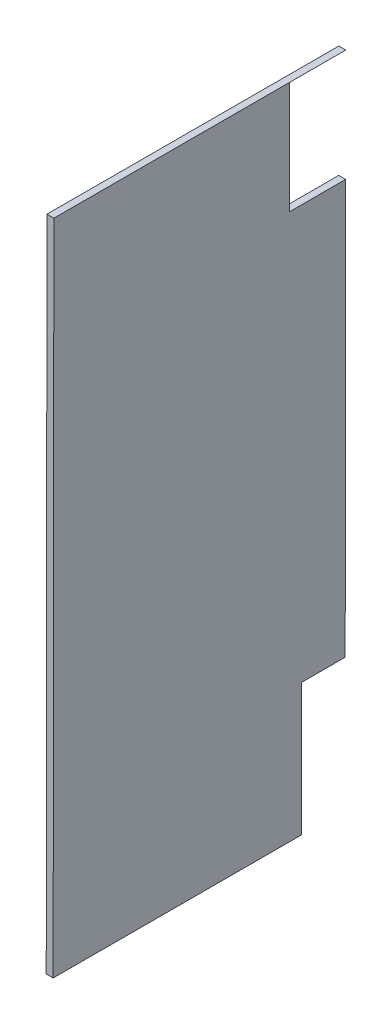
ISO-10303-21;
HEADER;
FILE_DESCRIPTION(('STEP AP214'),'2;1');
FILE_NAME('part.step','',(''),(''),'','','');
FILE_SCHEMA(('AUTOMOTIVE_DESIGN { 1 0 10303 214 1 1 1 1 }'));
ENDSEC;
DATA;
#1=APPLICATION_CONTEXT('core data for automotive mechanical design processes');
#2=APPLICATION_PROTOCOL_DEFINITION('international standard','automotive_design',2000,#1);
#3=PRODUCT_CONTEXT('',#1,'mechanical');
#4=PRODUCT('Part','Part','',(#3));
#5=PRODUCT_RELATED_PRODUCT_CATEGORY('part','',(#4));
#6=PRODUCT_DEFINITION_FORMATION('','',#4);
#7=PRODUCT_DEFINITION_CONTEXT('part definition',#1,'design');
#8=PRODUCT_DEFINITION('design','',#6,#7);
#9=PRODUCT_DEFINITION_SHAPE('','',#8);
#10=(LENGTH_UNIT() NAMED_UNIT(*) SI_UNIT(.MILLI.,.METRE.));
#11=(NAMED_UNIT(*) PLANE_ANGLE_UNIT() SI_UNIT($,.RADIAN.));
#12=(NAMED_UNIT(*) SI_UNIT($,.STERADIAN.) SOLID_ANGLE_UNIT());
#13=UNCERTAINTY_MEASURE_WITH_UNIT(LENGTH_MEASURE(1.E-05),#10,'distance_accuracy_value','');
#14=(GEOMETRIC_REPRESENTATION_CONTEXT(3) GLOBAL_UNCERTAINTY_ASSIGNED_CONTEXT((#13)) GLOBAL_UNIT_ASSIGNED_CONTEXT((#10,
#11,#12)) REPRESENTATION_CONTEXT('',''));
#15=CARTESIAN_POINT('',(0.,0.,0.));
#16=DIRECTION('',(0.,0.,1.));
#17=DIRECTION('',(1.,0.,0.));
#18=AXIS2_PLACEMENT_3D('',#15,#16,#17);
#19=CARTESIAN_POINT('',(5.08,1095.14597944637,-212.544479642971));
#20=DIRECTION('',(0.,0.00107241877587963,0.999999424958819));
#21=DIRECTION('',(0.,-0.999999424958819,0.00107241877587963));
#22=AXIS2_PLACEMENT_3D('',#19,#20,#21);
#23=PLANE('',#22);
#24=DIRECTION('',(0.,0.999999424958819,-0.00107241877587963));
#25=VECTOR('',#24,1.);
#26=CARTESIAN_POINT('',(0.,1095.14597944637,-212.544479642971));
#27=LINE('',#26,#25);
#28=CARTESIAN_POINT('',(0.,1192.07810946126,-212.648431538962));
#29=VERTEX_POINT('',#28);
#30=CARTESIAN_POINT('',(0.,1495.57463545746,-212.973907099016));
#31=VERTEX_POINT('',#30);
#32=EDGE_CURVE('E129',#29,#31,#27,.T.);
#33=ORIENTED_EDGE('',*,*,#32,.T.);
#34=DIRECTION('',(1.,0.,0.));
#35=VECTOR('',#34,1.);
#36=CARTESIAN_POINT('',(5.08,1495.57463545746,-212.973907099016));
#37=LINE('',#36,#35);
#38=CARTESIAN_POINT('',(5.08,1495.57463545746,-212.973907099016));
#39=VERTEX_POINT('',#38);
#40=EDGE_CURVE('E148',#31,#39,#37,.T.);
#41=ORIENTED_EDGE('',*,*,#40,.T.);
#42=DIRECTION('',(0.,0.999999424958819,-0.00107241877587963));
#43=VECTOR('',#42,1.);
#44=CARTESIAN_POINT('',(5.08,1095.14597944637,-212.544479642971));
#45=LINE('',#44,#43);
#46=CARTESIAN_POINT('',(5.08,1192.07810946126,-212.648431538962));
#47=VERTEX_POINT('',#46);
#48=EDGE_CURVE('E144',#47,#39,#45,.T.);
#49=ORIENTED_EDGE('',*,*,#48,.F.);
#50=DIRECTION('',(-1.,0.,0.));
#51=VECTOR('',#50,1.);
#52=CARTESIAN_POINT('',(5.08,1192.07810946126,-212.648431538962));
#53=LINE('',#52,#51);
#54=EDGE_CURVE('E161',#47,#29,#53,.T.);
#55=ORIENTED_EDGE('',*,*,#54,.T.);
#56=EDGE_LOOP('',(#33,#41,#49,#55));
#57=FACE_BOUND('',#56,.T.);
#58=ADVANCED_FACE('F41',(#57),#23,.F.);
#59=CARTESIAN_POINT('',(5.08,1577.97542074986,1.144110887981));
#60=DIRECTION('',(0.,-0.999999424958819,0.00107241877587918));
#61=DIRECTION('',(0.,-0.00107241877587918,-0.999999424958819));
#62=AXIS2_PLACEMENT_3D('',#59,#60,#61);
#63=PLANE('',#62);
#64=DIRECTION('',(0.,0.00107241877587918,0.999999424958819));
#65=VECTOR('',#64,1.);
#66=CARTESIAN_POINT('',(0.,1577.97542074986,1.144110887981));
#67=LINE('',#66,#65);
#68=CARTESIAN_POINT('',(0.,1577.7457019315,-213.062028944211));
#69=VERTEX_POINT('',#68);
#70=CARTESIAN_POINT('',(0.,1577.97542074986,1.144110887981));
#71=VERTEX_POINT('',#70);
#72=EDGE_CURVE('E121',#69,#71,#67,.T.);
#73=ORIENTED_EDGE('',*,*,#72,.T.);
#74=DIRECTION('',(-1.,0.,0.));
#75=VECTOR('',#74,1.);
#76=CARTESIAN_POINT('',(5.08,1577.97542074986,1.144110887981));
#77=LINE('',#76,#75);
#78=CARTESIAN_POINT('',(5.08,1577.97542074986,1.144110887981));
#79=VERTEX_POINT('',#78);
#80=EDGE_CURVE('E134',#79,#71,#77,.T.);
#81=ORIENTED_EDGE('',*,*,#80,.F.);
#82=DIRECTION('',(0.,0.00107241877587918,0.999999424958819));
#83=VECTOR('',#82,1.);
#84=CARTESIAN_POINT('',(5.08,1577.97542074986,1.144110887981));
#85=LINE('',#84,#83);
#86=CARTESIAN_POINT('',(5.08,1577.7457019315,-213.062028944211));
#87=VERTEX_POINT('',#86);
#88=EDGE_CURVE('E133',#87,#79,#85,.T.);
#89=ORIENTED_EDGE('',*,*,#88,.F.);
#90=DIRECTION('',(-1.,0.,0.));
#91=VECTOR('',#90,1.);
#92=CARTESIAN_POINT('',(5.08,1577.7457019315,-213.062028944211));
#93=LINE('',#92,#91);
#94=EDGE_CURVE('E48',#87,#69,#93,.T.);
#95=ORIENTED_EDGE('',*,*,#94,.T.);
#96=EDGE_LOOP('',(#73,#81,#89,#95));
#97=FACE_BOUND('',#96,.T.);
#98=ADVANCED_FACE('F132',(#97),#63,.F.);
#99=CARTESIAN_POINT('',(5.08,1095.37569826473,1.6616601892202));
#100=DIRECTION('',(0.,-0.001072418775879,-0.999999424958819));
#101=DIRECTION('',(0.,0.999999424958819,-0.001072418775879));
#102=AXIS2_PLACEMENT_3D('',#99,#100,#101);
#103=PLANE('',#102);
#104=DIRECTION('',(0.,-0.999999424958819,0.001072418775879));
#105=VECTOR('',#104,1.);
#106=CARTESIAN_POINT('',(0.,1095.37569826473,1.6616601892202));
#107=LINE('',#106,#105);
#108=CARTESIAN_POINT('',(0.,1095.37569826473,1.6616601892202));
#109=VERTEX_POINT('',#108);
#110=EDGE_CURVE('E125',#71,#109,#107,.T.);
#111=ORIENTED_EDGE('',*,*,#110,.T.);
#112=DIRECTION('',(-1.,0.,0.));
#113=VECTOR('',#112,1.);
#114=CARTESIAN_POINT('',(5.08,1095.37569826473,1.6616601892202));
#115=LINE('',#114,#113);
#116=CARTESIAN_POINT('',(5.08,1095.37569826473,1.6616601892202));
#117=VERTEX_POINT('',#116);
#118=EDGE_CURVE('E135',#117,#109,#115,.T.);
#119=ORIENTED_EDGE('',*,*,#118,.F.);
#120=DIRECTION('',(0.,-0.999999424958819,0.001072418775879));
#121=VECTOR('',#120,1.);
#122=CARTESIAN_POINT('',(5.08,1095.37569826473,1.6616601892202));
#123=LINE('',#122,#121);
#124=EDGE_CURVE('E151',#79,#117,#123,.T.);
#125=ORIENTED_EDGE('',*,*,#124,.F.);
#126=ORIENTED_EDGE('',*,*,#80,.T.);
#127=EDGE_LOOP('',(#111,#119,#125,#126));
#128=FACE_BOUND('',#127,.T.);
#129=ADVANCED_FACE('F202',(#128),#103,.F.);
#130=CARTESIAN_POINT('',(5.08,1095.37569826473,1.6616601892202));
#131=DIRECTION('',(0.,0.999999424958819,-0.00107241877587918));
#132=DIRECTION('',(0.,0.00107241877587918,0.999999424958819));
#133=AXIS2_PLACEMENT_3D('',#130,#131,#132);
#134=PLANE('',#133);
#135=DIRECTION('',(0.,-0.00107241877587918,-0.999999424958819));
#136=VECTOR('',#135,1.);
#137=CARTESIAN_POINT('',(0.,1095.37569826473,1.6616601892202));
#138=LINE('',#137,#136);
#139=CARTESIAN_POINT('',(0.,1095.18044244148,-180.408735594156));
#140=VERTEX_POINT('',#139);
#141=EDGE_CURVE('E141',#109,#140,#138,.T.);
#142=ORIENTED_EDGE('',*,*,#141,.T.);
#143=DIRECTION('',(1.,0.,0.));
#144=VECTOR('',#143,1.);
#145=CARTESIAN_POINT('',(5.08,1095.18044244148,-180.408735594156));
#146=LINE('',#145,#144);
#147=CARTESIAN_POINT('',(5.08,1095.18044244148,-180.408735594156));
#148=VERTEX_POINT('',#147);
#149=EDGE_CURVE('E158',#140,#148,#146,.T.);
#150=ORIENTED_EDGE('',*,*,#149,.T.);
#151=DIRECTION('',(0.,-0.00107241877587918,-0.999999424958819));
#152=VECTOR('',#151,1.);
#153=CARTESIAN_POINT('',(5.08,1095.37569826473,1.6616601892202));
#154=LINE('',#153,#152);
#155=EDGE_CURVE('E140',#117,#148,#154,.T.);
#156=ORIENTED_EDGE('',*,*,#155,.F.);
#157=ORIENTED_EDGE('',*,*,#118,.T.);
#158=EDGE_LOOP('',(#142,#150,#156,#157));
#159=FACE_BOUND('',#158,.T.);
#160=ADVANCED_FACE('F198',(#159),#134,.F.);
#161=CARTESIAN_POINT('',(5.08,0.,0.));
#162=DIRECTION('',(-1.,0.,0.));
#163=DIRECTION('',(0.,0.,1.));
#164=AXIS2_PLACEMENT_3D('',#161,#162,#163);
#165=PLANE('',#164);
#166=ORIENTED_EDGE('',*,*,#48,.T.);
#167=DIRECTION('',(0.,0.,-1.));
#168=VECTOR('',#167,1.);
#169=CARTESIAN_POINT('',(5.08,1495.57463545746,-213.062028944211));
#170=LINE('',#169,#168);
#171=CARTESIAN_POINT('',(5.08,1495.57463545746,-171.74101053983));
#172=VERTEX_POINT('',#171);
#173=EDGE_CURVE('E118',#172,#39,#170,.T.);
#174=ORIENTED_EDGE('',*,*,#173,.F.);
#175=DIRECTION('',(0.,-1.,0.));
#176=VECTOR('',#175,1.);
#177=CARTESIAN_POINT('',(5.08,1577.7457019315,-171.74101053983));
#178=LINE('',#177,#176);
#179=CARTESIAN_POINT('',(5.08,1577.7457019315,-171.74101053983));
#180=VERTEX_POINT('',#179);
#181=EDGE_CURVE('E177',#180,#172,#178,.T.);
#182=ORIENTED_EDGE('',*,*,#181,.F.);
#183=DIRECTION('',(0.,0.,1.));
#184=VECTOR('',#183,1.);
#185=CARTESIAN_POINT('',(5.08,1577.7457019315,-213.062028944211));
#186=LINE('',#185,#184);
#187=EDGE_CURVE('E170',#87,#180,#186,.T.);
#188=ORIENTED_EDGE('',*,*,#187,.F.);
#189=ORIENTED_EDGE('',*,*,#88,.T.);
#190=ORIENTED_EDGE('',*,*,#124,.T.);
#191=ORIENTED_EDGE('',*,*,#155,.T.);
#192=DIRECTION('',(0.,-1.,0.));
#193=VECTOR('',#192,1.);
#194=CARTESIAN_POINT('',(5.08,1192.07810946126,-180.408735594156));
#195=LINE('',#194,#193);
#196=CARTESIAN_POINT('',(5.08,1192.07810946126,-180.408735594156));
#197=VERTEX_POINT('',#196);
#198=EDGE_CURVE('E168',#197,#148,#195,.T.);
#199=ORIENTED_EDGE('',*,*,#198,.F.);
#200=DIRECTION('',(0.,0.,1.));
#201=VECTOR('',#200,1.);
#202=CARTESIAN_POINT('',(5.08,1192.07810946126,-180.408735594156));
#203=LINE('',#202,#201);
#204=EDGE_CURVE('E166',#47,#197,#203,.T.);
#205=ORIENTED_EDGE('',*,*,#204,.F.);
#206=EDGE_LOOP('',(#166,#174,#182,#188,#189,#190,#191,#199,#205));
#207=FACE_BOUND('',#206,.T.);
#208=ADVANCED_FACE('F193',(#207),#165,.F.);
#209=CARTESIAN_POINT('',(0.,0.,0.));
#210=DIRECTION('',(-1.,0.,0.));
#211=DIRECTION('',(0.,0.,1.));
#212=AXIS2_PLACEMENT_3D('',#209,#210,#211);
#213=PLANE('',#212);
#214=DIRECTION('',(0.,0.,-1.));
#215=VECTOR('',#214,1.);
#216=CARTESIAN_POINT('',(0.,1495.57463545746,-213.062028944211));
#217=LINE('',#216,#215);
#218=CARTESIAN_POINT('',(0.,1495.57463545746,-171.74101053983));
#219=VERTEX_POINT('',#218);
#220=EDGE_CURVE('E174',#219,#31,#217,.T.);
#221=ORIENTED_EDGE('',*,*,#220,.T.);
#222=ORIENTED_EDGE('',*,*,#32,.F.);
#223=DIRECTION('',(0.,0.,-1.));
#224=VECTOR('',#223,1.);
#225=CARTESIAN_POINT('',(0.,1192.07810946126,0.));
#226=LINE('',#225,#224);
#227=CARTESIAN_POINT('',(0.,1192.07810946126,-180.408735594156));
#228=VERTEX_POINT('',#227);
#229=EDGE_CURVE('E11',#228,#29,#226,.T.);
#230=ORIENTED_EDGE('',*,*,#229,.F.);
#231=DIRECTION('',(0.,-1.,0.));
#232=VECTOR('',#231,1.);
#233=CARTESIAN_POINT('',(0.,1192.07810946126,-180.408735594156));
#234=LINE('',#233,#232);
#235=EDGE_CURVE('E63',#228,#140,#234,.T.);
#236=ORIENTED_EDGE('',*,*,#235,.T.);
#237=ORIENTED_EDGE('',*,*,#141,.F.);
#238=ORIENTED_EDGE('',*,*,#110,.F.);
#239=ORIENTED_EDGE('',*,*,#72,.F.);
#240=DIRECTION('',(0.,0.,1.));
#241=VECTOR('',#240,1.);
#242=CARTESIAN_POINT('',(0.,1577.7457019315,-213.062028944211));
#243=LINE('',#242,#241);
#244=CARTESIAN_POINT('',(0.,1577.7457019315,-171.74101053983));
#245=VERTEX_POINT('',#244);
#246=EDGE_CURVE('E110',#69,#245,#243,.T.);
#247=ORIENTED_EDGE('',*,*,#246,.T.);
#248=DIRECTION('',(0.,-1.,0.));
#249=VECTOR('',#248,1.);
#250=CARTESIAN_POINT('',(0.,1577.7457019315,-171.74101053983));
#251=LINE('',#250,#249);
#252=EDGE_CURVE('E55',#245,#219,#251,.T.);
#253=ORIENTED_EDGE('',*,*,#252,.T.);
#254=EDGE_LOOP('',(#221,#222,#230,#236,#237,#238,#239,#247,#253));
#255=FACE_BOUND('',#254,.T.);
#256=ADVANCED_FACE('F123',(#255),#213,.T.);
#257=CARTESIAN_POINT('',(0.,1192.07810946126,-180.408735594156));
#258=DIRECTION('',(0.,0.,1.));
#259=DIRECTION('',(1.,0.,0.));
#260=AXIS2_PLACEMENT_3D('',#257,#258,#259);
#261=PLANE('',#260);
#262=ORIENTED_EDGE('',*,*,#235,.F.);
#263=DIRECTION('',(1.,0.,0.));
#264=VECTOR('',#263,1.);
#265=CARTESIAN_POINT('',(0.,1192.07810946126,-180.408735594156));
#266=LINE('',#265,#264);
#267=EDGE_CURVE('E167',#228,#197,#266,.T.);
#268=ORIENTED_EDGE('',*,*,#267,.T.);
#269=ORIENTED_EDGE('',*,*,#198,.T.);
#270=ORIENTED_EDGE('',*,*,#149,.F.);
#271=EDGE_LOOP('',(#262,#268,#269,#270));
#272=FACE_BOUND('',#271,.T.);
#273=ADVANCED_FACE('F196',(#272),#261,.F.);
#274=CARTESIAN_POINT('',(0.,1192.07810946126,-180.408735594156));
#275=DIRECTION('',(0.,1.,0.));
#276=DIRECTION('',(0.,0.,1.));
#277=AXIS2_PLACEMENT_3D('',#274,#275,#276);
#278=PLANE('',#277);
#279=ORIENTED_EDGE('',*,*,#204,.T.);
#280=ORIENTED_EDGE('',*,*,#267,.F.);
#281=ORIENTED_EDGE('',*,*,#229,.T.);
#282=ORIENTED_EDGE('',*,*,#54,.F.);
#283=EDGE_LOOP('',(#279,#280,#281,#282));
#284=FACE_BOUND('',#283,.T.);
#285=ADVANCED_FACE('F190',(#284),#278,.F.);
#286=CARTESIAN_POINT('',(0.,1495.57463545746,-213.062028944211));
#287=DIRECTION('',(0.,-1.,0.));
#288=DIRECTION('',(0.,0.,-1.));
#289=AXIS2_PLACEMENT_3D('',#286,#287,#288);
#290=PLANE('',#289);
#291=ORIENTED_EDGE('',*,*,#220,.F.);
#292=DIRECTION('',(1.,0.,0.));
#293=VECTOR('',#292,1.);
#294=CARTESIAN_POINT('',(0.,1495.57463545746,-171.74101053983));
#295=LINE('',#294,#293);
#296=EDGE_CURVE('E164',#219,#172,#295,.T.);
#297=ORIENTED_EDGE('',*,*,#296,.T.);
#298=ORIENTED_EDGE('',*,*,#173,.T.);
#299=ORIENTED_EDGE('',*,*,#40,.F.);
#300=EDGE_LOOP('',(#291,#297,#298,#299));
#301=FACE_BOUND('',#300,.T.);
#302=ADVANCED_FACE('F205',(#301),#290,.F.);
#303=CARTESIAN_POINT('',(0.,1577.7457019315,-171.74101053983));
#304=DIRECTION('',(0.,0.,1.));
#305=DIRECTION('',(1.,0.,0.));
#306=AXIS2_PLACEMENT_3D('',#303,#304,#305);
#307=PLANE('',#306);
#308=ORIENTED_EDGE('',*,*,#181,.T.);
#309=ORIENTED_EDGE('',*,*,#296,.F.);
#310=ORIENTED_EDGE('',*,*,#252,.F.);
#311=DIRECTION('',(1.,0.,0.));
#312=VECTOR('',#311,1.);
#313=CARTESIAN_POINT('',(0.,1577.7457019315,-171.74101053983));
#314=LINE('',#313,#312);
#315=EDGE_CURVE('E116',#245,#180,#314,.T.);
#316=ORIENTED_EDGE('',*,*,#315,.T.);
#317=EDGE_LOOP('',(#308,#309,#310,#316));
#318=FACE_BOUND('',#317,.T.);
#319=ADVANCED_FACE('F204',(#318),#307,.F.);
#320=CARTESIAN_POINT('',(0.,1577.7457019315,-213.062028944211));
#321=DIRECTION('',(0.,1.,0.));
#322=DIRECTION('',(0.,0.,1.));
#323=AXIS2_PLACEMENT_3D('',#320,#321,#322);
#324=PLANE('',#323);
#325=ORIENTED_EDGE('',*,*,#187,.T.);
#326=ORIENTED_EDGE('',*,*,#315,.F.);
#327=ORIENTED_EDGE('',*,*,#246,.F.);
#328=ORIENTED_EDGE('',*,*,#94,.F.);
#329=EDGE_LOOP('',(#325,#326,#327,#328));
#330=FACE_BOUND('',#329,.T.);
#331=ADVANCED_FACE('F113',(#330),#324,.F.);
#332=CLOSED_SHELL('',(#58,#98,#129,#160,#208,#256,#273,#285,#302,#319,#331));
#333=MANIFOLD_SOLID_BREP('B2',#332);
#334=ADVANCED_BREP_SHAPE_REPRESENTATION('',(#18,#333),#14);
#335=SHAPE_DEFINITION_REPRESENTATION(#9,#334);
ENDSEC;
END-ISO-10303-21;
